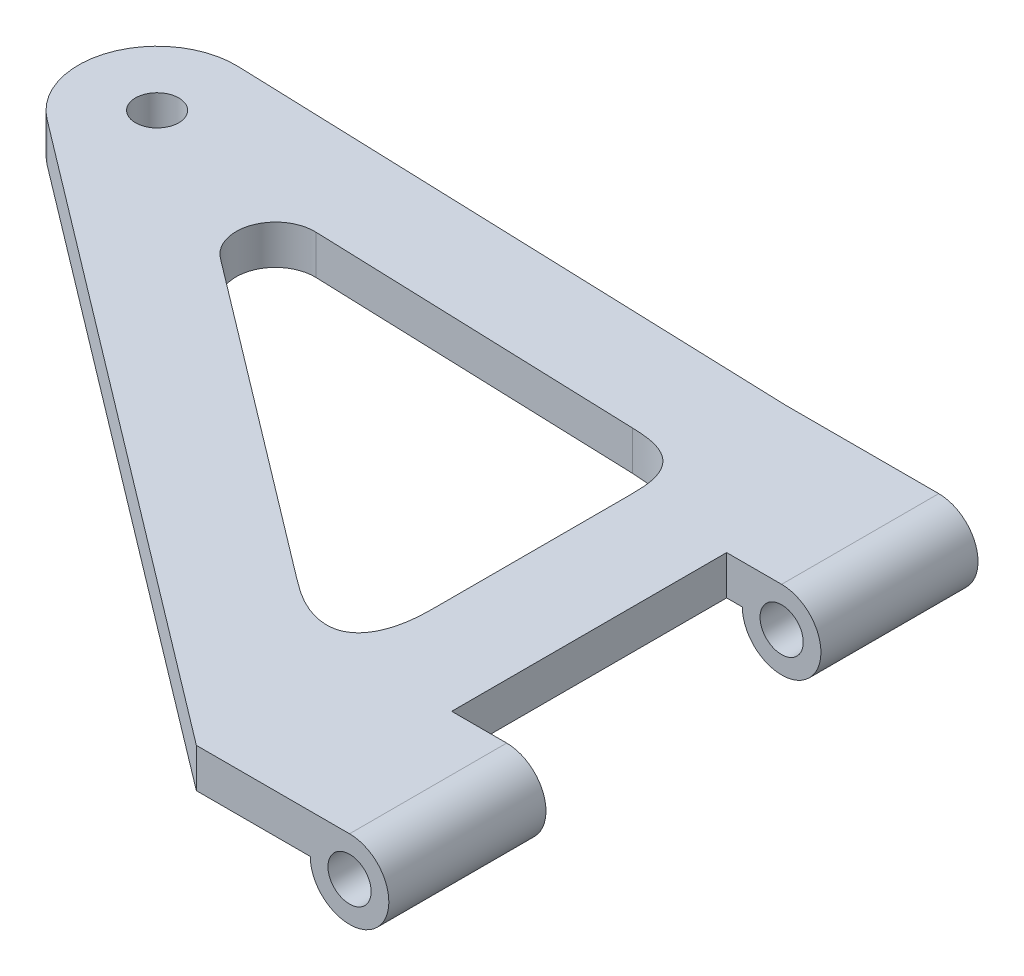
ISO-10303-21;
HEADER;
FILE_DESCRIPTION(('STEP AP214'),'2;1');
FILE_NAME('part.step','',(''),(''),'','','');
FILE_SCHEMA(('AUTOMOTIVE_DESIGN { 1 0 10303 214 1 1 1 1 }'));
ENDSEC;
DATA;
#1=APPLICATION_CONTEXT('core data for automotive mechanical design processes');
#2=APPLICATION_PROTOCOL_DEFINITION('international standard','automotive_design',2000,#1);
#3=PRODUCT_CONTEXT('',#1,'mechanical');
#4=PRODUCT('Part','Part','',(#3));
#5=PRODUCT_RELATED_PRODUCT_CATEGORY('part','',(#4));
#6=PRODUCT_DEFINITION_FORMATION('','',#4);
#7=PRODUCT_DEFINITION_CONTEXT('part definition',#1,'design');
#8=PRODUCT_DEFINITION('design','',#6,#7);
#9=PRODUCT_DEFINITION_SHAPE('','',#8);
#10=(LENGTH_UNIT() NAMED_UNIT(*) SI_UNIT(.MILLI.,.METRE.));
#11=(NAMED_UNIT(*) PLANE_ANGLE_UNIT() SI_UNIT($,.RADIAN.));
#12=(NAMED_UNIT(*) SI_UNIT($,.STERADIAN.) SOLID_ANGLE_UNIT());
#13=UNCERTAINTY_MEASURE_WITH_UNIT(LENGTH_MEASURE(1.E-05),#10,'distance_accuracy_value','');
#14=(GEOMETRIC_REPRESENTATION_CONTEXT(3) GLOBAL_UNCERTAINTY_ASSIGNED_CONTEXT((#13)) GLOBAL_UNIT_ASSIGNED_CONTEXT((#10,
#11,#12)) REPRESENTATION_CONTEXT('',''));
#15=CARTESIAN_POINT('',(0.,0.,0.));
#16=DIRECTION('',(0.,0.,1.));
#17=DIRECTION('',(1.,0.,0.));
#18=AXIS2_PLACEMENT_3D('',#15,#16,#17);
#19=CARTESIAN_POINT('',(0.,2.,0.));
#20=DIRECTION('',(0.,0.,1.));
#21=DIRECTION('',(-1.,0.,0.));
#22=AXIS2_PLACEMENT_3D('',#19,#20,#21);
#23=PLANE('',#22);
#24=DIRECTION('',(1.,0.,0.));
#25=VECTOR('',#24,1.);
#26=CARTESIAN_POINT('',(0.,0.,0.));
#27=LINE('',#26,#25);
#28=CARTESIAN_POINT('',(-5.,0.,0.));
#29=VERTEX_POINT('',#28);
#30=CARTESIAN_POINT('',(0.8,0.,0.));
#31=VERTEX_POINT('',#30);
#32=EDGE_CURVE('E300',#29,#31,#27,.T.);
#33=ORIENTED_EDGE('',*,*,#32,.T.);
#34=CARTESIAN_POINT('',(2.8,0.,0.));
#35=DIRECTION('',(0.,0.,-1.));
#36=DIRECTION('',(-1.,0.,0.));
#37=AXIS2_PLACEMENT_3D('',#34,#35,#36);
#38=CIRCLE('',#37,2.);
#39=CARTESIAN_POINT('',(2.8,2.,0.));
#40=VERTEX_POINT('',#39);
#41=EDGE_CURVE('E177',#40,#31,#38,.T.);
#42=ORIENTED_EDGE('',*,*,#41,.F.);
#43=DIRECTION('',(1.,0.,0.));
#44=VECTOR('',#43,1.);
#45=CARTESIAN_POINT('',(0.,2.,0.));
#46=LINE('',#45,#44);
#47=CARTESIAN_POINT('',(-5.,2.,0.));
#48=VERTEX_POINT('',#47);
#49=EDGE_CURVE('E182',#48,#40,#46,.T.);
#50=ORIENTED_EDGE('',*,*,#49,.F.);
#51=DIRECTION('',(0.,-1.,0.));
#52=VECTOR('',#51,1.);
#53=CARTESIAN_POINT('',(-5.,2.,0.));
#54=LINE('',#53,#52);
#55=EDGE_CURVE('E315',#48,#29,#54,.T.);
#56=ORIENTED_EDGE('',*,*,#55,.T.);
#57=EDGE_LOOP('',(#33,#42,#50,#56));
#58=FACE_BOUND('',#57,.T.);
#59=CARTESIAN_POINT('',(2.8,0.,0.));
#60=DIRECTION('',(0.,0.,1.));
#61=DIRECTION('',(1.,0.,0.));
#62=AXIS2_PLACEMENT_3D('',#59,#60,#61);
#63=CIRCLE('',#62,1.09999999999999);
#64=CARTESIAN_POINT('',(3.89999999999999,0.,0.));
#65=VERTEX_POINT('',#64);
#66=EDGE_CURVE('E529',#65,#65,#63,.T.);
#67=ORIENTED_EDGE('',*,*,#66,.F.);
#68=EDGE_LOOP('',(#67));
#69=FACE_BOUND('',#68,.T.);
#70=ADVANCED_FACE('F43',(#58,#69),#23,.T.);
#71=CARTESIAN_POINT('',(0.,2.,0.));
#72=DIRECTION('',(1.,0.,0.));
#73=DIRECTION('',(0.,0.,1.));
#74=AXIS2_PLACEMENT_3D('',#71,#72,#73);
#75=PLANE('',#74);
#76=DIRECTION('',(0.,0.,-1.));
#77=VECTOR('',#76,1.);
#78=CARTESIAN_POINT('',(0.,0.,0.));
#79=LINE('',#78,#77);
#80=CARTESIAN_POINT('',(0.,0.,-8.));
#81=VERTEX_POINT('',#80);
#82=CARTESIAN_POINT('',(0.,0.,-22.));
#83=VERTEX_POINT('',#82);
#84=EDGE_CURVE('E294',#81,#83,#79,.T.);
#85=ORIENTED_EDGE('',*,*,#84,.T.);
#86=DIRECTION('',(0.,-1.,0.));
#87=VECTOR('',#86,1.);
#88=CARTESIAN_POINT('',(0.,0.,-22.));
#89=LINE('',#88,#87);
#90=CARTESIAN_POINT('',(0.,2.,-22.));
#91=VERTEX_POINT('',#90);
#92=EDGE_CURVE('E185',#91,#83,#89,.T.);
#93=ORIENTED_EDGE('',*,*,#92,.F.);
#94=DIRECTION('',(0.,0.,-1.));
#95=VECTOR('',#94,1.);
#96=CARTESIAN_POINT('',(0.,2.,0.));
#97=LINE('',#96,#95);
#98=CARTESIAN_POINT('',(0.,2.,-8.));
#99=VERTEX_POINT('',#98);
#100=EDGE_CURVE('E169',#99,#91,#97,.T.);
#101=ORIENTED_EDGE('',*,*,#100,.F.);
#102=DIRECTION('',(0.,1.,0.));
#103=VECTOR('',#102,1.);
#104=CARTESIAN_POINT('',(0.,2.,-8.));
#105=LINE('',#104,#103);
#106=EDGE_CURVE('E172',#81,#99,#105,.T.);
#107=ORIENTED_EDGE('',*,*,#106,.F.);
#108=EDGE_LOOP('',(#85,#93,#101,#107));
#109=FACE_BOUND('',#108,.T.);
#110=ADVANCED_FACE('F181',(#109),#75,.T.);
#111=CARTESIAN_POINT('',(1.02974988057846,2.,-29.7915809087655));
#112=DIRECTION('',(0.0345445006245153,0.,-0.999403160629684));
#113=DIRECTION('',(0.999403160629684,0.,0.0345445006245153));
#114=AXIS2_PLACEMENT_3D('',#111,#112,#113);
#115=PLANE('',#114);
#116=DIRECTION('',(-0.999403160629684,0.,-0.0345445006245153));
#117=VECTOR('',#116,1.);
#118=CARTESIAN_POINT('',(1.02974988057846,0.,-29.7915809087655));
#119=LINE('',#118,#117);
#120=CARTESIAN_POINT('',(-5.,0.,-30.));
#121=VERTEX_POINT('',#120);
#122=CARTESIAN_POINT('',(-33.8618219975019,0.,-30.9976126425187));
#123=VERTEX_POINT('',#122);
#124=EDGE_CURVE('E282',#121,#123,#119,.T.);
#125=ORIENTED_EDGE('',*,*,#124,.T.);
#126=DIRECTION('',(0.,-1.,0.));
#127=VECTOR('',#126,1.);
#128=CARTESIAN_POINT('',(-33.8618219975019,2.,-30.9976126425187));
#129=LINE('',#128,#127);
#130=CARTESIAN_POINT('',(-33.8618219975019,2.,-30.9976126425187));
#131=VERTEX_POINT('',#130);
#132=EDGE_CURVE('E306',#131,#123,#129,.T.);
#133=ORIENTED_EDGE('',*,*,#132,.F.);
#134=DIRECTION('',(-0.999403160629684,0.,-0.0345445006245153));
#135=VECTOR('',#134,1.);
#136=CARTESIAN_POINT('',(1.02974988057846,2.,-29.7915809087655));
#137=LINE('',#136,#135);
#138=CARTESIAN_POINT('',(-5.,2.,-30.));
#139=VERTEX_POINT('',#138);
#140=EDGE_CURVE('E189',#139,#131,#137,.T.);
#141=ORIENTED_EDGE('',*,*,#140,.F.);
#142=DIRECTION('',(0.,-1.,0.));
#143=VECTOR('',#142,1.);
#144=CARTESIAN_POINT('',(-5.,2.,-30.));
#145=LINE('',#144,#143);
#146=EDGE_CURVE('E314',#139,#121,#145,.T.);
#147=ORIENTED_EDGE('',*,*,#146,.T.);
#148=EDGE_LOOP('',(#125,#133,#141,#147));
#149=FACE_BOUND('',#148,.T.);
#150=ADVANCED_FACE('F427',(#149),#115,.T.);
#151=CARTESIAN_POINT('',(0.,2.,-30.));
#152=DIRECTION('',(0.,0.,-1.));
#153=DIRECTION('',(1.,0.,0.));
#154=AXIS2_PLACEMENT_3D('',#151,#152,#153);
#155=PLANE('',#154);
#156=CARTESIAN_POINT('',(2.8,0.,-30.));
#157=DIRECTION('',(0.,0.,1.));
#158=DIRECTION('',(1.,0.,0.));
#159=AXIS2_PLACEMENT_3D('',#156,#157,#158);
#160=CIRCLE('',#159,1.09999999999999);
#161=CARTESIAN_POINT('',(3.89999999999999,0.,-30.));
#162=VERTEX_POINT('',#161);
#163=EDGE_CURVE('E528',#162,#162,#160,.T.);
#164=ORIENTED_EDGE('',*,*,#163,.T.);
#165=EDGE_LOOP('',(#164));
#166=FACE_BOUND('',#165,.T.);
#167=DIRECTION('',(-1.,0.,0.));
#168=VECTOR('',#167,1.);
#169=CARTESIAN_POINT('',(0.,0.,-30.));
#170=LINE('',#169,#168);
#171=CARTESIAN_POINT('',(0.8,0.,-30.));
#172=VERTEX_POINT('',#171);
#173=EDGE_CURVE('E291',#172,#121,#170,.T.);
#174=ORIENTED_EDGE('',*,*,#173,.T.);
#175=ORIENTED_EDGE('',*,*,#146,.F.);
#176=DIRECTION('',(-1.,0.,0.));
#177=VECTOR('',#176,1.);
#178=CARTESIAN_POINT('',(0.,2.,-30.));
#179=LINE('',#178,#177);
#180=CARTESIAN_POINT('',(2.8,2.,-30.));
#181=VERTEX_POINT('',#180);
#182=EDGE_CURVE('E183',#181,#139,#179,.T.);
#183=ORIENTED_EDGE('',*,*,#182,.F.);
#184=CARTESIAN_POINT('',(2.8,0.,-30.));
#185=DIRECTION('',(0.,0.,1.));
#186=DIRECTION('',(1.,0.,0.));
#187=AXIS2_PLACEMENT_3D('',#184,#185,#186);
#188=CIRCLE('',#187,2.);
#189=EDGE_CURVE('E499',#172,#181,#188,.T.);
#190=ORIENTED_EDGE('',*,*,#189,.F.);
#191=EDGE_LOOP('',(#174,#175,#183,#190));
#192=FACE_BOUND('',#191,.T.);
#193=ADVANCED_FACE('F421',(#166,#192),#155,.T.);
#194=CARTESIAN_POINT('',(-1.82439463446999,2.,2.40698097002595));
#195=DIRECTION('',(-0.604052089553541,0.,0.796944836927877));
#196=DIRECTION('',(-0.796944836927877,0.,-0.604052089553541));
#197=AXIS2_PLACEMENT_3D('',#194,#195,#196);
#198=PLANE('',#197);
#199=DIRECTION('',(0.796944836927877,0.,0.604052089553541));
#200=VECTOR('',#199,1.);
#201=CARTESIAN_POINT('',(-1.82439463446999,0.,2.40698097002595));
#202=LINE('',#201,#200);
#203=CARTESIAN_POINT('',(-36.4162083582142,0.,-23.8122206522885));
#204=VERTEX_POINT('',#203);
#205=EDGE_CURVE('E297',#204,#29,#202,.T.);
#206=ORIENTED_EDGE('',*,*,#205,.T.);
#207=ORIENTED_EDGE('',*,*,#55,.F.);
#208=DIRECTION('',(0.796944836927877,0.,0.604052089553541));
#209=VECTOR('',#208,1.);
#210=CARTESIAN_POINT('',(-1.82439463446999,2.,2.40698097002595));
#211=LINE('',#210,#209);
#212=CARTESIAN_POINT('',(-36.4162083582142,2.,-23.8122206522885));
#213=VERTEX_POINT('',#212);
#214=EDGE_CURVE('E187',#213,#48,#211,.T.);
#215=ORIENTED_EDGE('',*,*,#214,.F.);
#216=DIRECTION('',(0.,-1.,0.));
#217=VECTOR('',#216,1.);
#218=CARTESIAN_POINT('',(-36.4162083582142,2.,-23.8122206522885));
#219=LINE('',#218,#217);
#220=EDGE_CURVE('E307',#213,#204,#219,.T.);
#221=ORIENTED_EDGE('',*,*,#220,.T.);
#222=EDGE_LOOP('',(#206,#207,#215,#221));
#223=FACE_BOUND('',#222,.T.);
#224=ADVANCED_FACE('F264',(#223),#198,.T.);
#225=CARTESIAN_POINT('',(-5.,2.,0.));
#226=DIRECTION('',(-1.,0.,0.));
#227=DIRECTION('',(0.,0.,-1.));
#228=AXIS2_PLACEMENT_3D('',#225,#226,#227);
#229=PLANE('',#228);
#230=DIRECTION('',(0.,0.,1.));
#231=VECTOR('',#230,1.);
#232=CARTESIAN_POINT('',(-5.,2.,0.));
#233=LINE('',#232,#231);
#234=CARTESIAN_POINT('',(-5.,2.,-22.0989178249634));
#235=VERTEX_POINT('',#234);
#236=CARTESIAN_POINT('',(-5.,2.,-12.3122151170277));
#237=VERTEX_POINT('',#236);
#238=EDGE_CURVE('E211',#235,#237,#233,.T.);
#239=ORIENTED_EDGE('',*,*,#238,.F.);
#240=CARTESIAN_POINT('',(-5.,-0.0999999999999985,-22.0989178249634));
#241=CARTESIAN_POINT('',(-5.,0.633333333333335,-22.0989178249634));
#242=CARTESIAN_POINT('',(-5.,1.36666666666704,-22.0989178249634));
#243=CARTESIAN_POINT('',(-5.,2.1,-22.0989178249634));
#244=B_SPLINE_CURVE_WITH_KNOTS('',3,(#240,#241,#242,#243),.UNSPECIFIED.,.F.,.F.,(4,4),
(-9.99999999999998E-05,0.0021),.UNSPECIFIED.);
#245=CARTESIAN_POINT('',(-5.,0.,-22.0989178249634));
#246=VERTEX_POINT('',#245);
#247=EDGE_CURVE('E320',#246,#235,#244,.T.);
#248=ORIENTED_EDGE('',*,*,#247,.F.);
#249=DIRECTION('',(0.,0.,1.));
#250=VECTOR('',#249,1.);
#251=CARTESIAN_POINT('',(-5.,0.,0.));
#252=LINE('',#251,#250);
#253=CARTESIAN_POINT('',(-5.,0.,-12.3122151170277));
#254=VERTEX_POINT('',#253);
#255=EDGE_CURVE('E203',#246,#254,#252,.T.);
#256=ORIENTED_EDGE('',*,*,#255,.T.);
#257=CARTESIAN_POINT('',(-5.,2.1,-12.3122151170277));
#258=CARTESIAN_POINT('',(-5.,1.36666666666704,-12.3122151170277));
#259=CARTESIAN_POINT('',(-5.,0.633333333333335,-12.3122151170277));
#260=CARTESIAN_POINT('',(-5.,-0.0999999999999985,-12.3122151170277));
#261=B_SPLINE_CURVE_WITH_KNOTS('',3,(#257,#258,#259,#260),.UNSPECIFIED.,.F.,.F.,(4,4),(-0.0001,
0.0021),.UNSPECIFIED.);
#262=EDGE_CURVE('E368',#237,#254,#261,.T.);
#263=ORIENTED_EDGE('',*,*,#262,.F.);
#264=EDGE_LOOP('',(#239,#248,#256,#263));
#265=FACE_BOUND('',#264,.T.);
#266=ADVANCED_FACE('F256',(#265),#229,.T.);
#267=CARTESIAN_POINT('',(0.857027377455887,2.,-24.7945651056171));
#268=DIRECTION('',(0.0345445006245156,0.,-0.999403160629684));
#269=DIRECTION('',(0.999403160629684,0.,0.0345445006245156));
#270=AXIS2_PLACEMENT_3D('',#267,#268,#269);
#271=PLANE('',#270);
#272=DIRECTION('',(-0.999403160629684,0.,-0.0345445006245156));
#273=VECTOR('',#272,1.);
#274=CARTESIAN_POINT('',(0.857027377455887,2.,-24.7945651056171));
#275=LINE('',#274,#273);
#276=CARTESIAN_POINT('',(-7.89636649812646,2.,-25.0971273068524));
#277=VERTEX_POINT('',#276);
#278=CARTESIAN_POINT('',(-24.577554455632,2.,-25.6737147447515));
#279=VERTEX_POINT('',#278);
#280=EDGE_CURVE('E219',#277,#279,#275,.T.);
#281=ORIENTED_EDGE('',*,*,#280,.T.);
#282=DIRECTION('',(0.,-1.,0.));
#283=VECTOR('',#282,1.);
#284=CARTESIAN_POINT('',(-24.577554455632,2.,-25.6737147447515));
#285=LINE('',#284,#283);
#286=CARTESIAN_POINT('',(-24.577554455632,0.,-25.6737147447515));
#287=VERTEX_POINT('',#286);
#288=EDGE_CURVE('E208',#279,#287,#285,.T.);
#289=ORIENTED_EDGE('',*,*,#288,.T.);
#290=DIRECTION('',(-0.999403160629684,0.,-0.0345445006245156));
#291=VECTOR('',#290,1.);
#292=CARTESIAN_POINT('',(0.857027377455887,0.,-24.7945651056171));
#293=LINE('',#292,#291);
#294=CARTESIAN_POINT('',(-7.89636649812646,0.,-25.0971273068524));
#295=VERTEX_POINT('',#294);
#296=EDGE_CURVE('E206',#295,#287,#293,.T.);
#297=ORIENTED_EDGE('',*,*,#296,.F.);
#298=CARTESIAN_POINT('',(-7.89636649812645,2.1,-25.0971273068524));
#299=CARTESIAN_POINT('',(-7.89636649812645,1.36666666666704,-25.0971273068524));
#300=CARTESIAN_POINT('',(-7.89636649812645,0.633333333333335,-25.0971273068524));
#301=CARTESIAN_POINT('',(-7.89636649812645,-0.0999999999999985,-25.0971273068524));
#302=B_SPLINE_CURVE_WITH_KNOTS('',3,(#298,#299,#300,#301),.UNSPECIFIED.,.F.,.F.,(4,4),(-0.0001,
0.0021),.UNSPECIFIED.);
#303=EDGE_CURVE('E237',#277,#295,#302,.T.);
#304=ORIENTED_EDGE('',*,*,#303,.F.);
#305=EDGE_LOOP('',(#281,#289,#297,#304));
#306=FACE_BOUND('',#305,.T.);
#307=ADVANCED_FACE('F246',(#306),#271,.F.);
#308=CARTESIAN_POINT('',(-24.646643456881,2.,-23.6749084234921));
#309=DIRECTION('',(0.,-1.,0.));
#310=DIRECTION('',(0.,0.,-1.));
#311=AXIS2_PLACEMENT_3D('',#308,#309,#310);
#312=CYLINDRICAL_SURFACE('',#311,2.);
#313=CARTESIAN_POINT('',(-24.646643456881,0.,-23.6749084234921));
#314=DIRECTION('',(0.,-1.,0.));
#315=DIRECTION('',(0.,0.,1.));
#316=AXIS2_PLACEMENT_3D('',#313,#314,#315);
#317=CIRCLE('',#316,2.);
#318=CARTESIAN_POINT('',(-25.8547476359881,0.,-22.0810187496364));
#319=VERTEX_POINT('',#318);
#320=EDGE_CURVE('E289',#319,#287,#317,.T.);
#321=ORIENTED_EDGE('',*,*,#320,.T.);
#322=ORIENTED_EDGE('',*,*,#288,.F.);
#323=CARTESIAN_POINT('',(-24.646643456881,2.,-23.6749084234921));
#324=DIRECTION('',(0.,-1.,0.));
#325=DIRECTION('',(0.,0.,1.));
#326=AXIS2_PLACEMENT_3D('',#323,#324,#325);
#327=CIRCLE('',#326,2.);
#328=CARTESIAN_POINT('',(-25.8547476359881,2.,-22.0810187496364));
#329=VERTEX_POINT('',#328);
#330=EDGE_CURVE('E227',#329,#279,#327,.T.);
#331=ORIENTED_EDGE('',*,*,#330,.F.);
#332=DIRECTION('',(0.,-1.,0.));
#333=VECTOR('',#332,1.);
#334=CARTESIAN_POINT('',(-25.8547476359881,2.,-22.0810187496364));
#335=LINE('',#334,#333);
#336=EDGE_CURVE('E200',#329,#319,#335,.T.);
#337=ORIENTED_EDGE('',*,*,#336,.T.);
#338=EDGE_LOOP('',(#321,#322,#331,#337));
#339=FACE_BOUND('',#338,.T.);
#340=ADVANCED_FACE('F259',(#339),#312,.F.);
#341=CARTESIAN_POINT('',(-34.,2.,-27.));
#342=DIRECTION('',(0.,-1.,0.));
#343=DIRECTION('',(0.,0.,-1.));
#344=AXIS2_PLACEMENT_3D('',#341,#342,#343);
#345=CYLINDRICAL_SURFACE('',#344,4.00000000000001);
#346=CARTESIAN_POINT('',(-34.,0.,-27.));
#347=DIRECTION('',(0.,-1.,0.));
#348=DIRECTION('',(0.,0.,1.));
#349=AXIS2_PLACEMENT_3D('',#346,#347,#348);
#350=CIRCLE('',#349,4.00000000000001);
#351=EDGE_CURVE('E305',#204,#123,#350,.T.);
#352=ORIENTED_EDGE('',*,*,#351,.F.);
#353=ORIENTED_EDGE('',*,*,#220,.F.);
#354=CARTESIAN_POINT('',(-34.,2.,-27.));
#355=DIRECTION('',(0.,-1.,0.));
#356=DIRECTION('',(0.,0.,1.));
#357=AXIS2_PLACEMENT_3D('',#354,#355,#356);
#358=CIRCLE('',#357,4.00000000000001);
#359=EDGE_CURVE('E195',#213,#131,#358,.T.);
#360=ORIENTED_EDGE('',*,*,#359,.T.);
#361=ORIENTED_EDGE('',*,*,#132,.T.);
#362=EDGE_LOOP('',(#352,#353,#360,#361));
#363=FACE_BOUND('',#362,.T.);
#364=ADVANCED_FACE('F416',(#363),#345,.T.);
#365=CARTESIAN_POINT('',(1.1958658132977,2.,-1.57774321461343));
#366=DIRECTION('',(-0.604052089553541,0.,0.796944836927877));
#367=DIRECTION('',(-0.796944836927877,0.,-0.604052089553541));
#368=AXIS2_PLACEMENT_3D('',#365,#366,#367);
#369=PLANE('',#368);
#370=DIRECTION('',(0.796944836927877,0.,0.604052089553541));
#371=VECTOR('',#370,1.);
#372=CARTESIAN_POINT('',(1.1958658132977,0.,-1.57774321461343));
#373=LINE('',#372,#371);
#374=CARTESIAN_POINT('',(-9.81215626866063,0.,-9.92138060624411));
#375=VERTEX_POINT('',#374);
#376=EDGE_CURVE('E279',#319,#375,#373,.T.);
#377=ORIENTED_EDGE('',*,*,#376,.F.);
#378=ORIENTED_EDGE('',*,*,#336,.F.);
#379=DIRECTION('',(0.796944836927877,0.,0.604052089553541));
#380=VECTOR('',#379,1.);
#381=CARTESIAN_POINT('',(1.1958658132977,2.,-1.57774321461343));
#382=LINE('',#381,#380);
#383=CARTESIAN_POINT('',(-9.81215626866062,2.,-9.92138060624411));
#384=VERTEX_POINT('',#383);
#385=EDGE_CURVE('E286',#329,#384,#382,.T.);
#386=ORIENTED_EDGE('',*,*,#385,.T.);
#387=CARTESIAN_POINT('',(-9.81215626866062,-0.0999999999999985,-9.92138060624411));
#388=CARTESIAN_POINT('',(-9.81215626866062,0.633333333333335,-9.92138060624411));
#389=CARTESIAN_POINT('',(-9.81215626866062,1.36666666666704,-9.92138060624411));
#390=CARTESIAN_POINT('',(-9.81215626866062,2.1,-9.92138060624411));
#391=B_SPLINE_CURVE_WITH_KNOTS('',3,(#387,#388,#389,#390),.UNSPECIFIED.,.F.,.F.,(4,4),
(-9.99999999999998E-05,0.0021),.UNSPECIFIED.);
#392=EDGE_CURVE('E339',#375,#384,#391,.T.);
#393=ORIENTED_EDGE('',*,*,#392,.F.);
#394=EDGE_LOOP('',(#377,#378,#386,#393));
#395=FACE_BOUND('',#394,.T.);
#396=ADVANCED_FACE('F412',(#395),#369,.F.);
#397=CARTESIAN_POINT('',(-34.,2.,-27.));
#398=DIRECTION('',(0.,-1.,0.));
#399=DIRECTION('',(0.,0.,-1.));
#400=AXIS2_PLACEMENT_3D('',#397,#398,#399);
#401=CYLINDRICAL_SURFACE('',#400,1.1);
#402=CARTESIAN_POINT('',(-34.,2.,-27.));
#403=DIRECTION('',(0.,-1.,0.));
#404=DIRECTION('',(0.,0.,1.));
#405=AXIS2_PLACEMENT_3D('',#402,#403,#404);
#406=CIRCLE('',#405,1.1);
#407=CARTESIAN_POINT('',(-34.,2.,-25.9));
#408=VERTEX_POINT('',#407);
#409=EDGE_CURVE('E192',#408,#408,#406,.T.);
#410=ORIENTED_EDGE('',*,*,#409,.F.);
#411=EDGE_LOOP('',(#410));
#412=FACE_BOUND('',#411,.T.);
#413=CARTESIAN_POINT('',(-34.,0.,-27.));
#414=DIRECTION('',(0.,-1.,0.));
#415=DIRECTION('',(0.,0.,1.));
#416=AXIS2_PLACEMENT_3D('',#413,#414,#415);
#417=CIRCLE('',#416,1.1);
#418=CARTESIAN_POINT('',(-34.,0.,-25.9));
#419=VERTEX_POINT('',#418);
#420=EDGE_CURVE('E216',#419,#419,#417,.T.);
#421=ORIENTED_EDGE('',*,*,#420,.T.);
#422=EDGE_LOOP('',(#421));
#423=FACE_BOUND('',#422,.T.);
#424=ADVANCED_FACE('F394',(#412,#423),#401,.F.);
#425=CARTESIAN_POINT('',(0.,2.,0.));
#426=DIRECTION('',(0.,1.,0.));
#427=DIRECTION('',(0.,0.,1.));
#428=AXIS2_PLACEMENT_3D('',#425,#426,#427);
#429=PLANE('',#428);
#430=ORIENTED_EDGE('',*,*,#238,.T.);
#431=CARTESIAN_POINT('',(-9.81215626866062,2.,-9.92138060624411));
#432=CARTESIAN_POINT('',(-9.11783682052307,2.,-9.39511442817097));
#433=CARTESIAN_POINT('',(-8.42351737238552,2.,-8.86884825009784));
#434=CARTESIAN_POINT('',(-6.66517207213474,2.,-8.19360385027882));
#435=CARTESIAN_POINT('',(-5.5239996146729,2.,-8.76057514998994));
#436=CARTESIAN_POINT('',(-5.,2.,-10.5697621492312));
#437=CARTESIAN_POINT('',(-5.,2.,-11.4409886331295));
#438=CARTESIAN_POINT('',(-5.,2.,-12.3122151170277));
#439=B_SPLINE_CURVE_WITH_KNOTS('',5,(#431,#432,#433,#434,#435,#436,#437,#438),.UNSPECIFIED.,.F.,
.F.,(6,2,6),(0.,0.5,1.),.UNSPECIFIED.);
#440=EDGE_CURVE('E335',#384,#237,#439,.T.);
#441=ORIENTED_EDGE('',*,*,#440,.F.);
#442=ORIENTED_EDGE('',*,*,#385,.F.);
#443=ORIENTED_EDGE('',*,*,#330,.T.);
#444=ORIENTED_EDGE('',*,*,#280,.F.);
#445=CARTESIAN_POINT('',(-5.,2.,-22.0989178249634));
#446=CARTESIAN_POINT('',(-5.,2.,-22.5890624710596));
#447=CARTESIAN_POINT('',(-5.,2.,-23.0792071171558));
#448=CARTESIAN_POINT('',(-5.20346333063777,2.,-24.161192951533));
#449=CARTESIAN_POINT('',(-5.84235075769709,2.,-24.8225451467431));
#450=CARTESIAN_POINT('',(-6.91666228117796,2.,-25.0632637027861));
#451=CARTESIAN_POINT('',(-7.40651438965221,2.,-25.0801955048193));
#452=CARTESIAN_POINT('',(-7.89636649812645,2.,-25.0971273068524));
#453=B_SPLINE_CURVE_WITH_KNOTS('',5,(#445,#446,#447,#448,#449,#450,#451,#452),.UNSPECIFIED.,.F.,
.F.,(6,2,6),(0.,0.5,1.),.UNSPECIFIED.);
#454=EDGE_CURVE('E11',#235,#277,#453,.T.);
#455=ORIENTED_EDGE('',*,*,#454,.F.);
#456=EDGE_LOOP('',(#430,#441,#442,#443,#444,#455));
#457=FACE_BOUND('',#456,.T.);
#458=ORIENTED_EDGE('',*,*,#140,.T.);
#459=ORIENTED_EDGE('',*,*,#359,.F.);
#460=ORIENTED_EDGE('',*,*,#214,.T.);
#461=ORIENTED_EDGE('',*,*,#49,.T.);
#462=DIRECTION('',(0.,0.,1.));
#463=VECTOR('',#462,1.);
#464=CARTESIAN_POINT('',(2.8,2.,-8.));
#465=LINE('',#464,#463);
#466=CARTESIAN_POINT('',(2.8,2.,-8.));
#467=VERTEX_POINT('',#466);
#468=EDGE_CURVE('E175',#467,#40,#465,.T.);
#469=ORIENTED_EDGE('',*,*,#468,.F.);
#470=DIRECTION('',(1.,0.,0.));
#471=VECTOR('',#470,1.);
#472=CARTESIAN_POINT('',(0.,2.,-8.));
#473=LINE('',#472,#471);
#474=EDGE_CURVE('E161',#99,#467,#473,.T.);
#475=ORIENTED_EDGE('',*,*,#474,.F.);
#476=ORIENTED_EDGE('',*,*,#100,.T.);
#477=DIRECTION('',(-1.,0.,0.));
#478=VECTOR('',#477,1.);
#479=CARTESIAN_POINT('',(0.,2.,-22.));
#480=LINE('',#479,#478);
#481=CARTESIAN_POINT('',(2.8,2.,-22.));
#482=VERTEX_POINT('',#481);
#483=EDGE_CURVE('E509',#482,#91,#480,.T.);
#484=ORIENTED_EDGE('',*,*,#483,.F.);
#485=DIRECTION('',(0.,0.,-1.));
#486=VECTOR('',#485,1.);
#487=CARTESIAN_POINT('',(2.8,2.,-22.));
#488=LINE('',#487,#486);
#489=EDGE_CURVE('E225',#482,#181,#488,.T.);
#490=ORIENTED_EDGE('',*,*,#489,.T.);
#491=ORIENTED_EDGE('',*,*,#182,.T.);
#492=EDGE_LOOP('',(#458,#459,#460,#461,#469,#475,#476,#484,#490,#491));
#493=FACE_BOUND('',#492,.T.);
#494=ORIENTED_EDGE('',*,*,#409,.T.);
#495=EDGE_LOOP('',(#494));
#496=FACE_BOUND('',#495,.T.);
#497=ADVANCED_FACE('F164',(#457,#493,#496),#429,.T.);
#498=CARTESIAN_POINT('',(0.,0.,0.));
#499=DIRECTION('',(0.,1.,0.));
#500=DIRECTION('',(0.,0.,1.));
#501=AXIS2_PLACEMENT_3D('',#498,#499,#500);
#502=PLANE('',#501);
#503=ORIENTED_EDGE('',*,*,#296,.T.);
#504=ORIENTED_EDGE('',*,*,#320,.F.);
#505=ORIENTED_EDGE('',*,*,#376,.T.);
#506=CARTESIAN_POINT('',(-5.,0.,-12.3122151170277));
#507=CARTESIAN_POINT('',(-5.,0.,-11.4409886331295));
#508=CARTESIAN_POINT('',(-5.,0.,-10.5697621492312));
#509=CARTESIAN_POINT('',(-5.5239996146729,0.,-8.76057514998994));
#510=CARTESIAN_POINT('',(-6.66517207213474,0.,-8.19360385027882));
#511=CARTESIAN_POINT('',(-8.42351737238552,0.,-8.86884825009784));
#512=CARTESIAN_POINT('',(-9.11783682052307,0.,-9.39511442817097));
#513=CARTESIAN_POINT('',(-9.81215626866062,0.,-9.92138060624411));
#514=B_SPLINE_CURVE_WITH_KNOTS('',5,(#506,#507,#508,#509,#510,#511,#512,#513),.UNSPECIFIED.,.F.,
.F.,(6,2,6),(0.,0.5,1.),.UNSPECIFIED.);
#515=EDGE_CURVE('E336',#254,#375,#514,.T.);
#516=ORIENTED_EDGE('',*,*,#515,.F.);
#517=ORIENTED_EDGE('',*,*,#255,.F.);
#518=CARTESIAN_POINT('',(-7.89636649812645,0.,-25.0971273068524));
#519=CARTESIAN_POINT('',(-7.40651438965221,0.,-25.0801955048193));
#520=CARTESIAN_POINT('',(-6.91666228117796,0.,-25.0632637027861));
#521=CARTESIAN_POINT('',(-5.84235075769709,0.,-24.8225451467431));
#522=CARTESIAN_POINT('',(-5.20346333063777,0.,-24.161192951533));
#523=CARTESIAN_POINT('',(-5.,0.,-23.0792071171557));
#524=CARTESIAN_POINT('',(-5.,0.,-22.5890624710596));
#525=CARTESIAN_POINT('',(-5.,0.,-22.0989178249634));
#526=B_SPLINE_CURVE_WITH_KNOTS('',5,(#518,#519,#520,#521,#522,#523,#524,#525),.UNSPECIFIED.,.F.,
.F.,(6,2,6),(0.,0.5,1.),.UNSPECIFIED.);
#527=EDGE_CURVE('E54',#295,#246,#526,.T.);
#528=ORIENTED_EDGE('',*,*,#527,.F.);
#529=EDGE_LOOP('',(#503,#504,#505,#516,#517,#528));
#530=FACE_BOUND('',#529,.T.);
#531=ORIENTED_EDGE('',*,*,#124,.F.);
#532=ORIENTED_EDGE('',*,*,#173,.F.);
#533=DIRECTION('',(0.,0.,-1.));
#534=VECTOR('',#533,1.);
#535=CARTESIAN_POINT('',(0.8,0.,-22.));
#536=LINE('',#535,#534);
#537=CARTESIAN_POINT('',(0.8,0.,-22.));
#538=VERTEX_POINT('',#537);
#539=EDGE_CURVE('E209',#538,#172,#536,.T.);
#540=ORIENTED_EDGE('',*,*,#539,.F.);
#541=DIRECTION('',(1.,0.,0.));
#542=VECTOR('',#541,1.);
#543=CARTESIAN_POINT('',(0.,0.,-22.));
#544=LINE('',#543,#542);
#545=EDGE_CURVE('E67',#83,#538,#544,.T.);
#546=ORIENTED_EDGE('',*,*,#545,.F.);
#547=ORIENTED_EDGE('',*,*,#84,.F.);
#548=DIRECTION('',(-1.,0.,0.));
#549=VECTOR('',#548,1.);
#550=CARTESIAN_POINT('',(0.,0.,-8.));
#551=LINE('',#550,#549);
#552=CARTESIAN_POINT('',(0.8,0.,-8.));
#553=VERTEX_POINT('',#552);
#554=EDGE_CURVE('E61',#553,#81,#551,.T.);
#555=ORIENTED_EDGE('',*,*,#554,.F.);
#556=DIRECTION('',(0.,0.,1.));
#557=VECTOR('',#556,1.);
#558=CARTESIAN_POINT('',(0.8,0.,-8.));
#559=LINE('',#558,#557);
#560=EDGE_CURVE('E504',#553,#31,#559,.T.);
#561=ORIENTED_EDGE('',*,*,#560,.T.);
#562=ORIENTED_EDGE('',*,*,#32,.F.);
#563=ORIENTED_EDGE('',*,*,#205,.F.);
#564=ORIENTED_EDGE('',*,*,#351,.T.);
#565=EDGE_LOOP('',(#531,#532,#540,#546,#547,#555,#561,#562,#563,#564));
#566=FACE_BOUND('',#565,.T.);
#567=ORIENTED_EDGE('',*,*,#420,.F.);
#568=EDGE_LOOP('',(#567));
#569=FACE_BOUND('',#568,.T.);
#570=ADVANCED_FACE('F326',(#530,#566,#569),#502,.F.);
#571=CARTESIAN_POINT('',(-5.,2.1,-12.3122151170277));
#572=CARTESIAN_POINT('',(-5.,1.36666666666704,-12.3122151170277));
#573=CARTESIAN_POINT('',(-5.,0.633333333333335,-12.3122151170277));
#574=CARTESIAN_POINT('',(-5.,-0.0999999999999985,-12.3122151170277));
#575=CARTESIAN_POINT('',(-5.,2.1,-11.4409886331295));
#576=CARTESIAN_POINT('',(-5.,1.36666666666704,-11.4409886331295));
#577=CARTESIAN_POINT('',(-5.,0.633333333333335,-11.4409886331295));
#578=CARTESIAN_POINT('',(-5.,-0.0999999999999985,-11.4409886331295));
#579=CARTESIAN_POINT('',(-5.,2.1,-10.5697621492312));
#580=CARTESIAN_POINT('',(-5.,1.36666666666704,-10.5697621492312));
#581=CARTESIAN_POINT('',(-5.,0.633333333333335,-10.5697621492312));
#582=CARTESIAN_POINT('',(-5.,-0.0999999999999985,-10.5697621492312));
#583=CARTESIAN_POINT('',(-5.5239996146729,2.1,-8.76057514998994));
#584=CARTESIAN_POINT('',(-5.5239996146729,1.36666666666704,-8.76057514998994));
#585=CARTESIAN_POINT('',(-5.5239996146729,0.633333333333335,-8.76057514998994));
#586=CARTESIAN_POINT('',(-5.5239996146729,-0.0999999999999985,-8.76057514998994));
#587=CARTESIAN_POINT('',(-6.66517207213474,2.1,-8.19360385027882));
#588=CARTESIAN_POINT('',(-6.66517207213474,1.36666666666704,-8.19360385027882));
#589=CARTESIAN_POINT('',(-6.66517207213474,0.633333333333335,-8.19360385027882));
#590=CARTESIAN_POINT('',(-6.66517207213474,-0.0999999999999985,-8.19360385027882));
#591=CARTESIAN_POINT('',(-8.42351737238552,2.1,-8.86884825009784));
#592=CARTESIAN_POINT('',(-8.42351737238552,1.36666666666704,-8.86884825009784));
#593=CARTESIAN_POINT('',(-8.42351737238552,0.633333333333335,-8.86884825009784));
#594=CARTESIAN_POINT('',(-8.42351737238552,-0.0999999999999985,-8.86884825009784));
#595=CARTESIAN_POINT('',(-9.11783682052307,2.1,-9.39511442817097));
#596=CARTESIAN_POINT('',(-9.11783682052307,1.36666666666704,-9.39511442817097));
#597=CARTESIAN_POINT('',(-9.11783682052307,0.633333333333335,-9.39511442817097));
#598=CARTESIAN_POINT('',(-9.11783682052307,-0.0999999999999985,-9.39511442817097));
#599=CARTESIAN_POINT('',(-9.81215626866062,2.1,-9.92138060624411));
#600=CARTESIAN_POINT('',(-9.81215626866062,1.36666666666704,-9.92138060624411));
#601=CARTESIAN_POINT('',(-9.81215626866062,0.633333333333335,-9.92138060624411));
#602=CARTESIAN_POINT('',(-9.81215626866062,-0.0999999999999985,-9.92138060624411));
#603=B_SPLINE_SURFACE_WITH_KNOTS('',5,3,((#571,#572,#573,#574),(#575,#576,#577,#578),(#579,#580,
#581,#582),(#583,#584,#585,#586),(#587,#588,#589,#590),(#591,#592,#593,#594),(#595,#596,#597,
#598),(#599,#600,#601,#602)),.UNSPECIFIED.,.F.,.F.,.F.,(6,2,6),(4,4),(0.,0.5,1.),(-0.0001,
0.0021),.UNSPECIFIED.);
#604=ORIENTED_EDGE('',*,*,#440,.T.);
#605=ORIENTED_EDGE('',*,*,#262,.T.);
#606=ORIENTED_EDGE('',*,*,#515,.T.);
#607=ORIENTED_EDGE('',*,*,#392,.T.);
#608=EDGE_LOOP('',(#604,#605,#606,#607));
#609=FACE_BOUND('',#608,.T.);
#610=ADVANCED_FACE('F265',(#609),#603,.F.);
#611=CARTESIAN_POINT('',(-7.89636649812645,2.1,-25.0971273068524));
#612=CARTESIAN_POINT('',(-7.89636649812645,1.36666666666704,-25.0971273068524));
#613=CARTESIAN_POINT('',(-7.89636649812645,0.633333333333335,-25.0971273068524));
#614=CARTESIAN_POINT('',(-7.89636649812645,-0.0999999999999985,-25.0971273068524));
#615=CARTESIAN_POINT('',(-7.40651438965221,2.1,-25.0801955048193));
#616=CARTESIAN_POINT('',(-7.40651438965221,1.36666666666704,-25.0801955048193));
#617=CARTESIAN_POINT('',(-7.40651438965221,0.633333333333335,-25.0801955048193));
#618=CARTESIAN_POINT('',(-7.40651438965221,-0.0999999999999985,-25.0801955048193));
#619=CARTESIAN_POINT('',(-6.91666228117796,2.1,-25.0632637027861));
#620=CARTESIAN_POINT('',(-6.91666228117796,1.36666666666704,-25.0632637027861));
#621=CARTESIAN_POINT('',(-6.91666228117796,0.633333333333335,-25.0632637027861));
#622=CARTESIAN_POINT('',(-6.91666228117796,-0.0999999999999985,-25.0632637027861));
#623=CARTESIAN_POINT('',(-5.84235075769709,2.1,-24.8225451467431));
#624=CARTESIAN_POINT('',(-5.84235075769709,1.36666666666704,-24.8225451467431));
#625=CARTESIAN_POINT('',(-5.84235075769709,0.633333333333335,-24.8225451467431));
#626=CARTESIAN_POINT('',(-5.84235075769709,-0.0999999999999985,-24.8225451467431));
#627=CARTESIAN_POINT('',(-5.20346333063777,2.1,-24.161192951533));
#628=CARTESIAN_POINT('',(-5.20346333063777,1.36666666666704,-24.161192951533));
#629=CARTESIAN_POINT('',(-5.20346333063777,0.633333333333335,-24.161192951533));
#630=CARTESIAN_POINT('',(-5.20346333063777,-0.0999999999999985,-24.161192951533));
#631=CARTESIAN_POINT('',(-5.,2.1,-23.0792071171557));
#632=CARTESIAN_POINT('',(-5.,1.36666666666704,-23.0792071171557));
#633=CARTESIAN_POINT('',(-5.,0.633333333333335,-23.0792071171557));
#634=CARTESIAN_POINT('',(-5.,-0.0999999999999985,-23.0792071171557));
#635=CARTESIAN_POINT('',(-5.,2.1,-22.5890624710596));
#636=CARTESIAN_POINT('',(-5.,1.36666666666704,-22.5890624710596));
#637=CARTESIAN_POINT('',(-5.,0.633333333333335,-22.5890624710596));
#638=CARTESIAN_POINT('',(-5.,-0.0999999999999985,-22.5890624710596));
#639=CARTESIAN_POINT('',(-5.,2.1,-22.0989178249634));
#640=CARTESIAN_POINT('',(-5.,1.36666666666704,-22.0989178249634));
#641=CARTESIAN_POINT('',(-5.,0.633333333333335,-22.0989178249634));
#642=CARTESIAN_POINT('',(-5.,-0.0999999999999985,-22.0989178249634));
#643=B_SPLINE_SURFACE_WITH_KNOTS('',5,3,((#611,#612,#613,#614),(#615,#616,#617,#618),(#619,#620,
#621,#622),(#623,#624,#625,#626),(#627,#628,#629,#630),(#631,#632,#633,#634),(#635,#636,#637,
#638),(#639,#640,#641,#642)),.UNSPECIFIED.,.F.,.F.,.F.,(6,2,6),(4,4),(0.,0.5,1.),(-0.0001,
0.0021),.UNSPECIFIED.);
#644=ORIENTED_EDGE('',*,*,#454,.T.);
#645=ORIENTED_EDGE('',*,*,#303,.T.);
#646=ORIENTED_EDGE('',*,*,#527,.T.);
#647=ORIENTED_EDGE('',*,*,#247,.T.);
#648=EDGE_LOOP('',(#644,#645,#646,#647));
#649=FACE_BOUND('',#648,.T.);
#650=ADVANCED_FACE('F44',(#649),#643,.F.);
#651=CARTESIAN_POINT('',(2.8,0.,-22.));
#652=DIRECTION('',(0.,0.,-1.));
#653=DIRECTION('',(1.,0.,0.));
#654=AXIS2_PLACEMENT_3D('',#651,#652,#653);
#655=CYLINDRICAL_SURFACE('',#654,2.);
#656=ORIENTED_EDGE('',*,*,#189,.T.);
#657=ORIENTED_EDGE('',*,*,#489,.F.);
#658=CARTESIAN_POINT('',(2.8,0.,-22.));
#659=DIRECTION('',(0.,0.,1.));
#660=DIRECTION('',(1.,0.,0.));
#661=AXIS2_PLACEMENT_3D('',#658,#659,#660);
#662=CIRCLE('',#661,2.);
#663=EDGE_CURVE('E502',#538,#482,#662,.T.);
#664=ORIENTED_EDGE('',*,*,#663,.F.);
#665=ORIENTED_EDGE('',*,*,#539,.T.);
#666=EDGE_LOOP('',(#656,#657,#664,#665));
#667=FACE_BOUND('',#666,.T.);
#668=ADVANCED_FACE('F391',(#667),#655,.T.);
#669=CARTESIAN_POINT('',(2.8,0.,-22.));
#670=DIRECTION('',(0.,0.,-1.));
#671=DIRECTION('',(1.,0.,0.));
#672=AXIS2_PLACEMENT_3D('',#669,#670,#671);
#673=PLANE('',#672);
#674=CARTESIAN_POINT('',(2.8,0.,-22.));
#675=DIRECTION('',(0.,0.,1.));
#676=DIRECTION('',(1.,0.,0.));
#677=AXIS2_PLACEMENT_3D('',#674,#675,#676);
#678=CIRCLE('',#677,1.09999999999999);
#679=CARTESIAN_POINT('',(3.89999999999999,0.,-22.));
#680=VERTEX_POINT('',#679);
#681=EDGE_CURVE('E49',#680,#680,#678,.T.);
#682=ORIENTED_EDGE('',*,*,#681,.F.);
#683=EDGE_LOOP('',(#682));
#684=FACE_BOUND('',#683,.T.);
#685=ORIENTED_EDGE('',*,*,#663,.T.);
#686=ORIENTED_EDGE('',*,*,#483,.T.);
#687=ORIENTED_EDGE('',*,*,#92,.T.);
#688=ORIENTED_EDGE('',*,*,#545,.T.);
#689=EDGE_LOOP('',(#685,#686,#687,#688));
#690=FACE_BOUND('',#689,.T.);
#691=ADVANCED_FACE('F489',(#684,#690),#673,.F.);
#692=CARTESIAN_POINT('',(2.8,0.,-8.));
#693=DIRECTION('',(0.,0.,1.));
#694=DIRECTION('',(-1.,0.,0.));
#695=AXIS2_PLACEMENT_3D('',#692,#693,#694);
#696=CYLINDRICAL_SURFACE('',#695,2.);
#697=ORIENTED_EDGE('',*,*,#41,.T.);
#698=ORIENTED_EDGE('',*,*,#560,.F.);
#699=CARTESIAN_POINT('',(2.8,0.,-8.));
#700=DIRECTION('',(0.,0.,-1.));
#701=DIRECTION('',(-1.,0.,0.));
#702=AXIS2_PLACEMENT_3D('',#699,#700,#701);
#703=CIRCLE('',#702,2.);
#704=EDGE_CURVE('E173',#467,#553,#703,.T.);
#705=ORIENTED_EDGE('',*,*,#704,.F.);
#706=ORIENTED_EDGE('',*,*,#468,.T.);
#707=EDGE_LOOP('',(#697,#698,#705,#706));
#708=FACE_BOUND('',#707,.T.);
#709=ADVANCED_FACE('F492',(#708),#696,.T.);
#710=CARTESIAN_POINT('',(2.8,0.,-8.));
#711=DIRECTION('',(0.,0.,1.));
#712=DIRECTION('',(-1.,0.,0.));
#713=AXIS2_PLACEMENT_3D('',#710,#711,#712);
#714=PLANE('',#713);
#715=CARTESIAN_POINT('',(2.8,0.,-8.));
#716=DIRECTION('',(0.,0.,-1.));
#717=DIRECTION('',(-1.,0.,0.));
#718=AXIS2_PLACEMENT_3D('',#715,#716,#717);
#719=CIRCLE('',#718,1.09999999999999);
#720=CARTESIAN_POINT('',(1.70000000000001,0.,-8.));
#721=VERTEX_POINT('',#720);
#722=EDGE_CURVE('E524',#721,#721,#719,.T.);
#723=ORIENTED_EDGE('',*,*,#722,.F.);
#724=EDGE_LOOP('',(#723));
#725=FACE_BOUND('',#724,.T.);
#726=ORIENTED_EDGE('',*,*,#106,.T.);
#727=ORIENTED_EDGE('',*,*,#474,.T.);
#728=ORIENTED_EDGE('',*,*,#704,.T.);
#729=ORIENTED_EDGE('',*,*,#554,.T.);
#730=EDGE_LOOP('',(#726,#727,#728,#729));
#731=FACE_BOUND('',#730,.T.);
#732=ADVANCED_FACE('F176',(#725,#731),#714,.F.);
#733=CARTESIAN_POINT('',(2.8,0.,-30.));
#734=DIRECTION('',(0.,0.,-1.));
#735=DIRECTION('',(1.,0.,0.));
#736=AXIS2_PLACEMENT_3D('',#733,#734,#735);
#737=CYLINDRICAL_SURFACE('',#736,1.09999999999999);
#738=ORIENTED_EDGE('',*,*,#66,.T.);
#739=EDGE_LOOP('',(#738));
#740=FACE_BOUND('',#739,.T.);
#741=ORIENTED_EDGE('',*,*,#722,.T.);
#742=EDGE_LOOP('',(#741));
#743=FACE_BOUND('',#742,.T.);
#744=ADVANCED_FACE('F539',(#740,#743),#737,.F.);
#745=ORIENTED_EDGE('',*,*,#163,.F.);
#746=EDGE_LOOP('',(#745));
#747=FACE_BOUND('',#746,.T.);
#748=ORIENTED_EDGE('',*,*,#681,.T.);
#749=EDGE_LOOP('',(#748));
#750=FACE_BOUND('',#749,.T.);
#751=ADVANCED_FACE('F531',(#747,#750),#737,.F.);
#752=CLOSED_SHELL('',(#70,#110,#150,#193,#224,#266,#307,#340,#364,#396,#424,#497,#570,#610,#650,
#668,#691,#709,#732,#744,#751));
#753=MANIFOLD_SOLID_BREP('B2',#752);
#754=ADVANCED_BREP_SHAPE_REPRESENTATION('',(#18,#753),#14);
#755=SHAPE_DEFINITION_REPRESENTATION(#9,#754);
ENDSEC;
END-ISO-10303-21;
